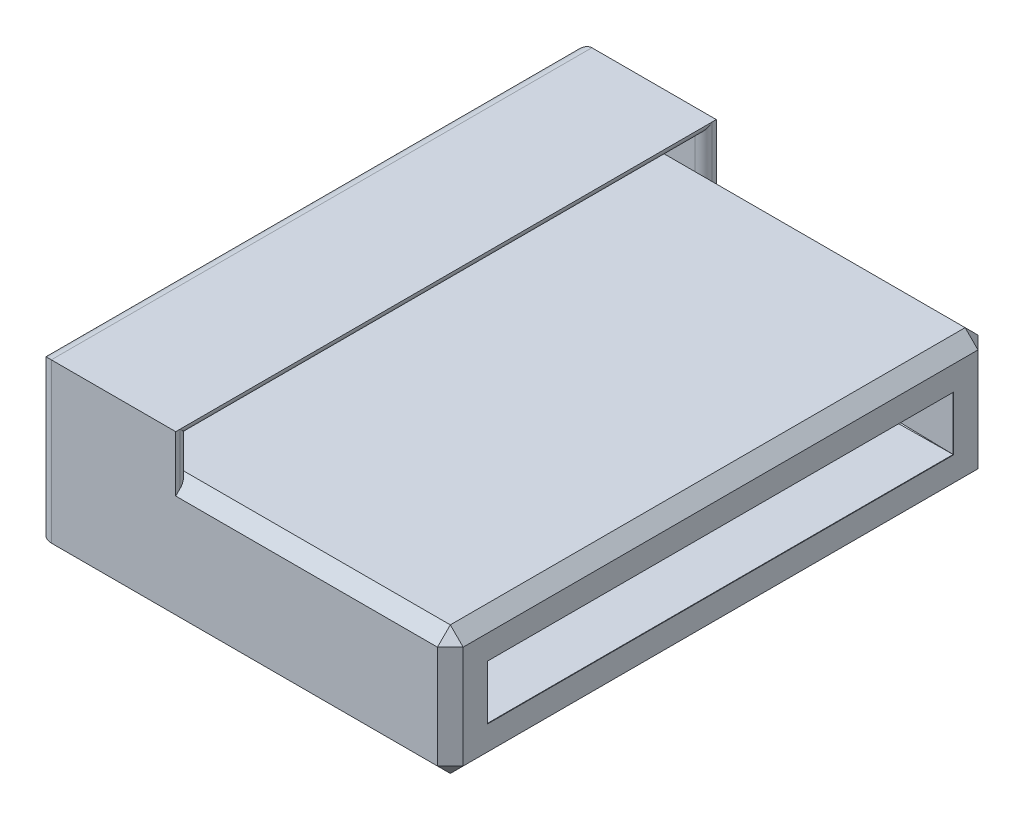
ISO-10303-21;
HEADER;
FILE_DESCRIPTION(('STEP AP214'),'2;1');
FILE_NAME('part.step','',(''),(''),'','','');
FILE_SCHEMA(('AUTOMOTIVE_DESIGN { 1 0 10303 214 1 1 1 1 }'));
ENDSEC;
DATA;
#1=APPLICATION_CONTEXT('core data for automotive mechanical design processes');
#2=APPLICATION_PROTOCOL_DEFINITION('international standard','automotive_design',2000,#1);
#3=PRODUCT_CONTEXT('',#1,'mechanical');
#4=PRODUCT('Part','Part','',(#3));
#5=PRODUCT_RELATED_PRODUCT_CATEGORY('part','',(#4));
#6=PRODUCT_DEFINITION_FORMATION('','',#4);
#7=PRODUCT_DEFINITION_CONTEXT('part definition',#1,'design');
#8=PRODUCT_DEFINITION('design','',#6,#7);
#9=PRODUCT_DEFINITION_SHAPE('','',#8);
#10=(LENGTH_UNIT() NAMED_UNIT(*) SI_UNIT(.MILLI.,.METRE.));
#11=(NAMED_UNIT(*) PLANE_ANGLE_UNIT() SI_UNIT($,.RADIAN.));
#12=(NAMED_UNIT(*) SI_UNIT($,.STERADIAN.) SOLID_ANGLE_UNIT());
#13=UNCERTAINTY_MEASURE_WITH_UNIT(LENGTH_MEASURE(1.E-05),#10,'distance_accuracy_value','');
#14=(GEOMETRIC_REPRESENTATION_CONTEXT(3) GLOBAL_UNCERTAINTY_ASSIGNED_CONTEXT((#13)) GLOBAL_UNIT_ASSIGNED_CONTEXT((#10,
#11,#12)) REPRESENTATION_CONTEXT('',''));
#15=CARTESIAN_POINT('',(0.,0.,0.));
#16=DIRECTION('',(0.,0.,1.));
#17=DIRECTION('',(1.,0.,0.));
#18=AXIS2_PLACEMENT_3D('',#15,#16,#17);
#19=CARTESIAN_POINT('',(24.,20.,31.5));
#20=DIRECTION('',(-1.,0.,0.));
#21=DIRECTION('',(0.,0.,1.));
#22=AXIS2_PLACEMENT_3D('',#19,#20,#21);
#23=PLANE('',#22);
#24=DIRECTION('',(0.,0.,-1.));
#25=VECTOR('',#24,1.);
#26=CARTESIAN_POINT('',(24.,1.50000000000002,-31.5));
#27=LINE('',#26,#25);
#28=CARTESIAN_POINT('',(24.,1.50000000000002,30.));
#29=VERTEX_POINT('',#28);
#30=CARTESIAN_POINT('',(24.,1.50000000000002,-30.));
#31=VERTEX_POINT('',#30);
#32=EDGE_CURVE('E460',#29,#31,#27,.T.);
#33=ORIENTED_EDGE('',*,*,#32,.T.);
#34=DIRECTION('',(0.,1.,0.));
#35=VECTOR('',#34,1.);
#36=CARTESIAN_POINT('',(24.,20.,-30.));
#37=LINE('',#36,#35);
#38=CARTESIAN_POINT('',(24.,13.5,-30.));
#39=VERTEX_POINT('',#38);
#40=EDGE_CURVE('E466',#31,#39,#37,.T.);
#41=ORIENTED_EDGE('',*,*,#40,.T.);
#42=DIRECTION('',(0.,0.,1.));
#43=VECTOR('',#42,1.);
#44=CARTESIAN_POINT('',(24.,13.5,31.5));
#45=LINE('',#44,#43);
#46=CARTESIAN_POINT('',(24.,13.5,30.));
#47=VERTEX_POINT('',#46);
#48=EDGE_CURVE('E464',#39,#47,#45,.T.);
#49=ORIENTED_EDGE('',*,*,#48,.T.);
#50=DIRECTION('',(0.,-1.,0.));
#51=VECTOR('',#50,1.);
#52=CARTESIAN_POINT('',(24.,20.,30.));
#53=LINE('',#52,#51);
#54=EDGE_CURVE('E462',#47,#29,#53,.T.);
#55=ORIENTED_EDGE('',*,*,#54,.T.);
#56=EDGE_LOOP('',(#33,#41,#49,#55));
#57=FACE_BOUND('',#56,.T.);
#58=DIRECTION('',(0.,0.,-1.));
#59=VECTOR('',#58,1.);
#60=CARTESIAN_POINT('',(24.,4.3284271247462,31.5));
#61=LINE('',#60,#59);
#62=CARTESIAN_POINT('',(24.,4.3284271247462,27.1715728752538));
#63=VERTEX_POINT('',#62);
#64=CARTESIAN_POINT('',(24.,4.3284271247462,-27.1715728752538));
#65=VERTEX_POINT('',#64);
#66=EDGE_CURVE('E252',#63,#65,#61,.T.);
#67=ORIENTED_EDGE('',*,*,#66,.F.);
#68=DIRECTION('',(0.,1.,0.));
#69=VECTOR('',#68,1.);
#70=CARTESIAN_POINT('',(24.,20.,27.1715728752538));
#71=LINE('',#70,#69);
#72=CARTESIAN_POINT('',(24.,10.6715728752538,27.1715728752538));
#73=VERTEX_POINT('',#72);
#74=EDGE_CURVE('E254',#73,#63,#71,.F.);
#75=ORIENTED_EDGE('',*,*,#74,.F.);
#76=DIRECTION('',(0.,0.,-1.));
#77=VECTOR('',#76,1.);
#78=CARTESIAN_POINT('',(24.,10.6715728752538,0.));
#79=LINE('',#78,#77);
#80=CARTESIAN_POINT('',(24.,10.6715728752538,-27.1715728752538));
#81=VERTEX_POINT('',#80);
#82=EDGE_CURVE('E267',#81,#73,#79,.F.);
#83=ORIENTED_EDGE('',*,*,#82,.F.);
#84=DIRECTION('',(0.,-1.,0.));
#85=VECTOR('',#84,1.);
#86=CARTESIAN_POINT('',(24.,20.,-27.1715728752538));
#87=LINE('',#86,#85);
#88=EDGE_CURVE('E269',#65,#81,#87,.F.);
#89=ORIENTED_EDGE('',*,*,#88,.F.);
#90=EDGE_LOOP('',(#67,#75,#83,#89));
#91=FACE_BOUND('',#90,.T.);
#92=ADVANCED_FACE('F35',(#57,#91),#23,.F.);
#93=CARTESIAN_POINT('',(-8.,15.,-31.5));
#94=DIRECTION('',(-1.,0.,0.));
#95=DIRECTION('',(0.,0.,1.));
#96=AXIS2_PLACEMENT_3D('',#93,#94,#95);
#97=PLANE('',#96);
#98=DIRECTION('',(0.,0.,1.));
#99=VECTOR('',#98,1.);
#100=CARTESIAN_POINT('',(-8.,20.,-31.5));
#101=LINE('',#100,#99);
#102=CARTESIAN_POINT('',(-8.,20.,-31.5));
#103=VERTEX_POINT('',#102);
#104=CARTESIAN_POINT('',(-8.,20.,-31.));
#105=VERTEX_POINT('',#104);
#106=EDGE_CURVE('E523',#103,#105,#101,.T.);
#107=ORIENTED_EDGE('',*,*,#106,.T.);
#108=DIRECTION('',(0.,1.,0.));
#109=VECTOR('',#108,1.);
#110=CARTESIAN_POINT('',(-8.,15.,-31.));
#111=LINE('',#110,#109);
#112=CARTESIAN_POINT('',(-8.,14.,-31.));
#113=VERTEX_POINT('',#112);
#114=EDGE_CURVE('E548',#105,#113,#111,.F.);
#115=ORIENTED_EDGE('',*,*,#114,.T.);
#116=DIRECTION('',(0.,0.707106781186548,0.707106781186548));
#117=VECTOR('',#116,1.);
#118=CARTESIAN_POINT('',(-8.,14.25,-30.75));
#119=LINE('',#118,#117);
#120=CARTESIAN_POINT('',(-8.,13.5,-31.5));
#121=VERTEX_POINT('',#120);
#122=EDGE_CURVE('E485',#113,#121,#119,.F.);
#123=ORIENTED_EDGE('',*,*,#122,.T.);
#124=DIRECTION('',(0.,1.,0.));
#125=VECTOR('',#124,1.);
#126=CARTESIAN_POINT('',(-8.,15.,-31.5));
#127=LINE('',#126,#125);
#128=EDGE_CURVE('E536',#121,#103,#127,.T.);
#129=ORIENTED_EDGE('',*,*,#128,.T.);
#130=EDGE_LOOP('',(#107,#115,#123,#129));
#131=FACE_BOUND('',#130,.T.);
#132=ADVANCED_FACE('F625',(#131),#97,.F.);
#133=CARTESIAN_POINT('',(-24.,20.,-31.5));
#134=DIRECTION('',(0.,0.,1.));
#135=DIRECTION('',(1.,0.,0.));
#136=AXIS2_PLACEMENT_3D('',#133,#134,#135);
#137=PLANE('',#136);
#138=DIRECTION('',(0.,-1.,0.));
#139=VECTOR('',#138,1.);
#140=CARTESIAN_POINT('',(22.5,20.,-31.5));
#141=LINE('',#140,#139);
#142=CARTESIAN_POINT('',(22.5,13.5,-31.5));
#143=VERTEX_POINT('',#142);
#144=CARTESIAN_POINT('',(22.5,1.50000000000002,-31.5));
#145=VERTEX_POINT('',#144);
#146=EDGE_CURVE('E440',#143,#145,#141,.T.);
#147=ORIENTED_EDGE('',*,*,#146,.T.);
#148=DIRECTION('',(-1.,0.,0.));
#149=VECTOR('',#148,1.);
#150=CARTESIAN_POINT('',(-22.5,1.50000000000002,-31.5));
#151=LINE('',#150,#149);
#152=CARTESIAN_POINT('',(-22.5,1.50000000000002,-31.5));
#153=VERTEX_POINT('',#152);
#154=EDGE_CURVE('E442',#145,#153,#151,.T.);
#155=ORIENTED_EDGE('',*,*,#154,.T.);
#156=DIRECTION('',(0.,-1.,0.));
#157=VECTOR('',#156,1.);
#158=CARTESIAN_POINT('',(-22.5,20.,-31.5));
#159=LINE('',#158,#157);
#160=CARTESIAN_POINT('',(-22.5,20.,-31.5));
#161=VERTEX_POINT('',#160);
#162=EDGE_CURVE('E560',#153,#161,#159,.F.);
#163=ORIENTED_EDGE('',*,*,#162,.T.);
#164=DIRECTION('',(-1.,0.,0.));
#165=VECTOR('',#164,1.);
#166=CARTESIAN_POINT('',(-24.,20.,-31.5));
#167=LINE('',#166,#165);
#168=EDGE_CURVE('E538',#103,#161,#167,.T.);
#169=ORIENTED_EDGE('',*,*,#168,.F.);
#170=ORIENTED_EDGE('',*,*,#128,.F.);
#171=DIRECTION('',(1.,0.,0.));
#172=VECTOR('',#171,1.);
#173=CARTESIAN_POINT('',(-24.,13.5,-31.5));
#174=LINE('',#173,#172);
#175=EDGE_CURVE('E438',#121,#143,#174,.T.);
#176=ORIENTED_EDGE('',*,*,#175,.T.);
#177=EDGE_LOOP('',(#147,#155,#163,#169,#170,#176));
#178=FACE_BOUND('',#177,.T.);
#179=ADVANCED_FACE('F630',(#178),#137,.F.);
#180=CARTESIAN_POINT('',(-24.,20.,31.5));
#181=DIRECTION('',(1.,0.,0.));
#182=DIRECTION('',(0.,0.,-1.));
#183=AXIS2_PLACEMENT_3D('',#180,#181,#182);
#184=PLANE('',#183);
#185=DIRECTION('',(0.,-1.,0.));
#186=VECTOR('',#185,1.);
#187=CARTESIAN_POINT('',(-24.,20.,-30.));
#188=LINE('',#187,#186);
#189=CARTESIAN_POINT('',(-24.,18.5,-30.));
#190=VERTEX_POINT('',#189);
#191=CARTESIAN_POINT('',(-24.,1.50000000000002,-30.));
#192=VERTEX_POINT('',#191);
#193=EDGE_CURVE('E557',#190,#192,#188,.T.);
#194=ORIENTED_EDGE('',*,*,#193,.T.);
#195=DIRECTION('',(0.,0.,1.));
#196=VECTOR('',#195,1.);
#197=CARTESIAN_POINT('',(-24.,1.50000000000002,30.));
#198=LINE('',#197,#196);
#199=CARTESIAN_POINT('',(-24.,1.50000000000002,30.));
#200=VERTEX_POINT('',#199);
#201=EDGE_CURVE('E456',#192,#200,#198,.T.);
#202=ORIENTED_EDGE('',*,*,#201,.T.);
#203=DIRECTION('',(0.,-1.,0.));
#204=VECTOR('',#203,1.);
#205=CARTESIAN_POINT('',(-24.,20.,30.));
#206=LINE('',#205,#204);
#207=CARTESIAN_POINT('',(-24.,18.5,30.));
#208=VERTEX_POINT('',#207);
#209=EDGE_CURVE('E511',#200,#208,#206,.F.);
#210=ORIENTED_EDGE('',*,*,#209,.T.);
#211=DIRECTION('',(0.,0.,1.));
#212=VECTOR('',#211,1.);
#213=CARTESIAN_POINT('',(-24.,18.5,31.5));
#214=LINE('',#213,#212);
#215=EDGE_CURVE('E555',#208,#190,#214,.F.);
#216=ORIENTED_EDGE('',*,*,#215,.T.);
#217=EDGE_LOOP('',(#194,#202,#210,#216));
#218=FACE_BOUND('',#217,.T.);
#219=ADVANCED_FACE('F771',(#218),#184,.F.);
#220=CARTESIAN_POINT('',(-24.,20.,31.5));
#221=DIRECTION('',(0.,0.,-1.));
#222=DIRECTION('',(-1.,0.,0.));
#223=AXIS2_PLACEMENT_3D('',#220,#221,#222);
#224=PLANE('',#223);
#225=DIRECTION('',(-1.,0.,0.));
#226=VECTOR('',#225,1.);
#227=CARTESIAN_POINT('',(-24.,13.5,31.5));
#228=LINE('',#227,#226);
#229=CARTESIAN_POINT('',(22.5,13.5,31.5));
#230=VERTEX_POINT('',#229);
#231=CARTESIAN_POINT('',(-7.99999999999999,13.5,31.5));
#232=VERTEX_POINT('',#231);
#233=EDGE_CURVE('E479',#230,#232,#228,.T.);
#234=ORIENTED_EDGE('',*,*,#233,.T.);
#235=DIRECTION('',(0.,1.,0.));
#236=VECTOR('',#235,1.);
#237=CARTESIAN_POINT('',(-7.99999999999999,15.,31.5));
#238=LINE('',#237,#236);
#239=CARTESIAN_POINT('',(-7.99999999999999,20.,31.5));
#240=VERTEX_POINT('',#239);
#241=EDGE_CURVE('E494',#232,#240,#238,.T.);
#242=ORIENTED_EDGE('',*,*,#241,.T.);
#243=DIRECTION('',(1.,0.,0.));
#244=VECTOR('',#243,1.);
#245=CARTESIAN_POINT('',(-24.,20.,31.5));
#246=LINE('',#245,#244);
#247=CARTESIAN_POINT('',(-22.5,20.,31.5));
#248=VERTEX_POINT('',#247);
#249=EDGE_CURVE('E542',#248,#240,#246,.T.);
#250=ORIENTED_EDGE('',*,*,#249,.F.);
#251=DIRECTION('',(0.,-1.,0.));
#252=VECTOR('',#251,1.);
#253=CARTESIAN_POINT('',(-22.5,20.,31.5));
#254=LINE('',#253,#252);
#255=CARTESIAN_POINT('',(-22.5,1.50000000000002,31.5));
#256=VERTEX_POINT('',#255);
#257=EDGE_CURVE('E435',#248,#256,#254,.T.);
#258=ORIENTED_EDGE('',*,*,#257,.T.);
#259=DIRECTION('',(1.,0.,0.));
#260=VECTOR('',#259,1.);
#261=CARTESIAN_POINT('',(24.,1.50000000000002,31.5));
#262=LINE('',#261,#260);
#263=CARTESIAN_POINT('',(22.5,1.50000000000002,31.5));
#264=VERTEX_POINT('',#263);
#265=EDGE_CURVE('E475',#256,#264,#262,.T.);
#266=ORIENTED_EDGE('',*,*,#265,.T.);
#267=DIRECTION('',(0.,1.,0.));
#268=VECTOR('',#267,1.);
#269=CARTESIAN_POINT('',(22.5,20.,31.5));
#270=LINE('',#269,#268);
#271=EDGE_CURVE('E477',#264,#230,#270,.T.);
#272=ORIENTED_EDGE('',*,*,#271,.T.);
#273=EDGE_LOOP('',(#234,#242,#250,#258,#266,#272));
#274=FACE_BOUND('',#273,.T.);
#275=ADVANCED_FACE('F569',(#274),#224,.F.);
#276=CARTESIAN_POINT('',(0.,20.,0.));
#277=DIRECTION('',(0.,-1.,0.));
#278=DIRECTION('',(0.,0.,-1.));
#279=AXIS2_PLACEMENT_3D('',#276,#277,#278);
#280=PLANE('',#279);
#281=ORIENTED_EDGE('',*,*,#168,.T.);
#282=DIRECTION('',(0.,0.,1.));
#283=VECTOR('',#282,1.);
#284=CARTESIAN_POINT('',(-22.5,20.,0.));
#285=LINE('',#284,#283);
#286=EDGE_CURVE('E561',#161,#248,#285,.T.);
#287=ORIENTED_EDGE('',*,*,#286,.T.);
#288=ORIENTED_EDGE('',*,*,#249,.T.);
#289=CARTESIAN_POINT('',(-7.99999999999999,20.,31.));
#290=VERTEX_POINT('',#289);
#291=EDGE_CURVE('E519',#290,#240,#101,.T.);
#292=ORIENTED_EDGE('',*,*,#291,.F.);
#293=EDGE_CURVE('E521',#105,#290,#101,.T.);
#294=ORIENTED_EDGE('',*,*,#293,.F.);
#295=ORIENTED_EDGE('',*,*,#106,.F.);
#296=EDGE_LOOP('',(#281,#287,#288,#292,#294,#295));
#297=FACE_BOUND('',#296,.T.);
#298=ADVANCED_FACE('F765',(#297),#280,.F.);
#299=CARTESIAN_POINT('',(0.,0.,0.));
#300=DIRECTION('',(0.,-1.,0.));
#301=DIRECTION('',(0.,0.,-1.));
#302=AXIS2_PLACEMENT_3D('',#299,#300,#301);
#303=PLANE('',#302);
#304=DIRECTION('',(0.,0.,-1.));
#305=VECTOR('',#304,1.);
#306=CARTESIAN_POINT('',(-22.5,0.,-30.));
#307=LINE('',#306,#305);
#308=CARTESIAN_POINT('',(-22.5,0.,30.));
#309=VERTEX_POINT('',#308);
#310=CARTESIAN_POINT('',(-22.5,0.,-30.));
#311=VERTEX_POINT('',#310);
#312=EDGE_CURVE('E449',#309,#311,#307,.T.);
#313=ORIENTED_EDGE('',*,*,#312,.T.);
#314=DIRECTION('',(1.,0.,0.));
#315=VECTOR('',#314,1.);
#316=CARTESIAN_POINT('',(24.,0.,-30.));
#317=LINE('',#316,#315);
#318=CARTESIAN_POINT('',(22.5,0.,-30.));
#319=VERTEX_POINT('',#318);
#320=EDGE_CURVE('E451',#311,#319,#317,.T.);
#321=ORIENTED_EDGE('',*,*,#320,.T.);
#322=DIRECTION('',(0.,0.,1.));
#323=VECTOR('',#322,1.);
#324=CARTESIAN_POINT('',(22.5,0.,31.5));
#325=LINE('',#324,#323);
#326=CARTESIAN_POINT('',(22.5,0.,30.));
#327=VERTEX_POINT('',#326);
#328=EDGE_CURVE('E445',#319,#327,#325,.T.);
#329=ORIENTED_EDGE('',*,*,#328,.T.);
#330=DIRECTION('',(-1.,0.,0.));
#331=VECTOR('',#330,1.);
#332=CARTESIAN_POINT('',(-22.5,0.,30.));
#333=LINE('',#332,#331);
#334=EDGE_CURVE('E447',#327,#309,#333,.T.);
#335=ORIENTED_EDGE('',*,*,#334,.T.);
#336=EDGE_LOOP('',(#313,#321,#329,#335));
#337=FACE_BOUND('',#336,.T.);
#338=ADVANCED_FACE('F587',(#337),#303,.T.);
#339=ORIENTED_EDGE('',*,*,#241,.F.);
#340=DIRECTION('',(0.,-0.707106781186548,0.707106781186548));
#341=VECTOR('',#340,1.);
#342=CARTESIAN_POINT('',(-8.,45.75,-0.750000000000001));
#343=LINE('',#342,#341);
#344=CARTESIAN_POINT('',(-7.99999999999999,14.,31.));
#345=VERTEX_POINT('',#344);
#346=EDGE_CURVE('E45',#232,#345,#343,.F.);
#347=ORIENTED_EDGE('',*,*,#346,.T.);
#348=DIRECTION('',(0.,-1.,0.));
#349=VECTOR('',#348,1.);
#350=CARTESIAN_POINT('',(-7.99999999999999,15.,31.));
#351=LINE('',#350,#349);
#352=EDGE_CURVE('E60',#345,#290,#351,.F.);
#353=ORIENTED_EDGE('',*,*,#352,.T.);
#354=ORIENTED_EDGE('',*,*,#291,.T.);
#355=EDGE_LOOP('',(#339,#347,#353,#354));
#356=FACE_BOUND('',#355,.T.);
#357=ADVANCED_FACE('F490',(#356),#97,.F.);
#358=CARTESIAN_POINT('',(0.,15.,0.));
#359=DIRECTION('',(0.,-1.,0.));
#360=DIRECTION('',(0.,0.,-1.));
#361=AXIS2_PLACEMENT_3D('',#358,#359,#360);
#362=PLANE('',#361);
#363=DIRECTION('',(0.,0.,-1.));
#364=VECTOR('',#363,1.);
#365=CARTESIAN_POINT('',(22.5,15.,0.));
#366=LINE('',#365,#364);
#367=CARTESIAN_POINT('',(22.5,15.,30.));
#368=VERTEX_POINT('',#367);
#369=CARTESIAN_POINT('',(22.5,15.,-30.));
#370=VERTEX_POINT('',#369);
#371=EDGE_CURVE('E471',#368,#370,#366,.T.);
#372=ORIENTED_EDGE('',*,*,#371,.T.);
#373=DIRECTION('',(-1.,0.,0.));
#374=VECTOR('',#373,1.);
#375=CARTESIAN_POINT('',(0.,15.,-30.));
#376=LINE('',#375,#374);
#377=CARTESIAN_POINT('',(-9.,15.,-30.));
#378=VERTEX_POINT('',#377);
#379=EDGE_CURVE('E473',#370,#378,#376,.T.);
#380=ORIENTED_EDGE('',*,*,#379,.T.);
#381=DIRECTION('',(1.,0.,0.));
#382=VECTOR('',#381,1.);
#383=CARTESIAN_POINT('',(-22.,15.,-30.));
#384=LINE('',#383,#382);
#385=CARTESIAN_POINT('',(-22.,15.,-30.));
#386=VERTEX_POINT('',#385);
#387=EDGE_CURVE('E532',#386,#378,#384,.T.);
#388=ORIENTED_EDGE('',*,*,#387,.F.);
#389=DIRECTION('',(0.,0.,-1.));
#390=VECTOR('',#389,1.);
#391=CARTESIAN_POINT('',(-22.,15.,-30.));
#392=LINE('',#391,#390);
#393=CARTESIAN_POINT('',(-22.,15.,30.));
#394=VERTEX_POINT('',#393);
#395=EDGE_CURVE('E517',#394,#386,#392,.T.);
#396=ORIENTED_EDGE('',*,*,#395,.F.);
#397=DIRECTION('',(1.,0.,0.));
#398=VECTOR('',#397,1.);
#399=CARTESIAN_POINT('',(-22.,15.,30.));
#400=LINE('',#399,#398);
#401=CARTESIAN_POINT('',(-8.99999999999999,15.,30.));
#402=VERTEX_POINT('',#401);
#403=EDGE_CURVE('E508',#394,#402,#400,.T.);
#404=ORIENTED_EDGE('',*,*,#403,.T.);
#405=DIRECTION('',(1.,0.,0.));
#406=VECTOR('',#405,1.);
#407=CARTESIAN_POINT('',(0.,15.,30.));
#408=LINE('',#407,#406);
#409=EDGE_CURVE('E469',#402,#368,#408,.T.);
#410=ORIENTED_EDGE('',*,*,#409,.T.);
#411=EDGE_LOOP('',(#372,#380,#388,#396,#404,#410));
#412=FACE_BOUND('',#411,.T.);
#413=ADVANCED_FACE('F515',(#412),#362,.F.);
#414=CARTESIAN_POINT('',(-22.,15.,30.));
#415=DIRECTION('',(0.,0.,1.));
#416=DIRECTION('',(1.,0.,0.));
#417=AXIS2_PLACEMENT_3D('',#414,#415,#416);
#418=PLANE('',#417);
#419=DIRECTION('',(1.,0.,0.));
#420=VECTOR('',#419,1.);
#421=CARTESIAN_POINT('',(-22.,19.,30.));
#422=LINE('',#421,#420);
#423=CARTESIAN_POINT('',(-22.,19.,30.));
#424=VERTEX_POINT('',#423);
#425=CARTESIAN_POINT('',(-8.99999999999999,19.,30.));
#426=VERTEX_POINT('',#425);
#427=EDGE_CURVE('E510',#424,#426,#422,.T.);
#428=ORIENTED_EDGE('',*,*,#427,.T.);
#429=DIRECTION('',(0.,-1.,0.));
#430=VECTOR('',#429,1.);
#431=CARTESIAN_POINT('',(-8.99999999999999,15.,30.));
#432=LINE('',#431,#430);
#433=EDGE_CURVE('E501',#426,#402,#432,.T.);
#434=ORIENTED_EDGE('',*,*,#433,.T.);
#435=ORIENTED_EDGE('',*,*,#403,.F.);
#436=DIRECTION('',(0.,-1.,0.));
#437=VECTOR('',#436,1.);
#438=CARTESIAN_POINT('',(-22.,15.,30.));
#439=LINE('',#438,#437);
#440=EDGE_CURVE('E527',#424,#394,#439,.T.);
#441=ORIENTED_EDGE('',*,*,#440,.F.);
#442=EDGE_LOOP('',(#428,#434,#435,#441));
#443=FACE_BOUND('',#442,.T.);
#444=ADVANCED_FACE('F506',(#443),#418,.F.);
#445=CARTESIAN_POINT('',(-22.,19.,30.));
#446=DIRECTION('',(0.,1.,0.));
#447=DIRECTION('',(0.,0.,1.));
#448=AXIS2_PLACEMENT_3D('',#445,#446,#447);
#449=PLANE('',#448);
#450=DIRECTION('',(1.,0.,0.));
#451=VECTOR('',#450,1.);
#452=CARTESIAN_POINT('',(-22.,19.,-30.));
#453=LINE('',#452,#451);
#454=CARTESIAN_POINT('',(-22.,19.,-30.));
#455=VERTEX_POINT('',#454);
#456=CARTESIAN_POINT('',(-9.,19.,-30.));
#457=VERTEX_POINT('',#456);
#458=EDGE_CURVE('E524',#455,#457,#453,.T.);
#459=ORIENTED_EDGE('',*,*,#458,.T.);
#460=DIRECTION('',(0.,0.,1.));
#461=VECTOR('',#460,1.);
#462=CARTESIAN_POINT('',(-8.99999999999999,19.,30.));
#463=LINE('',#462,#461);
#464=EDGE_CURVE('E512',#457,#426,#463,.T.);
#465=ORIENTED_EDGE('',*,*,#464,.T.);
#466=ORIENTED_EDGE('',*,*,#427,.F.);
#467=DIRECTION('',(0.,0.,1.));
#468=VECTOR('',#467,1.);
#469=CARTESIAN_POINT('',(-22.,19.,30.));
#470=LINE('',#469,#468);
#471=EDGE_CURVE('E744',#455,#424,#470,.T.);
#472=ORIENTED_EDGE('',*,*,#471,.F.);
#473=EDGE_LOOP('',(#459,#465,#466,#472));
#474=FACE_BOUND('',#473,.T.);
#475=ADVANCED_FACE('F742',(#474),#449,.F.);
#476=CARTESIAN_POINT('',(-22.,19.,-30.));
#477=DIRECTION('',(0.,0.,-1.));
#478=DIRECTION('',(-1.,0.,0.));
#479=AXIS2_PLACEMENT_3D('',#476,#477,#478);
#480=PLANE('',#479);
#481=ORIENTED_EDGE('',*,*,#387,.T.);
#482=DIRECTION('',(0.,1.,0.));
#483=VECTOR('',#482,1.);
#484=CARTESIAN_POINT('',(-9.,19.,-30.));
#485=LINE('',#484,#483);
#486=EDGE_CURVE('E544',#378,#457,#485,.T.);
#487=ORIENTED_EDGE('',*,*,#486,.T.);
#488=ORIENTED_EDGE('',*,*,#458,.F.);
#489=DIRECTION('',(0.,1.,0.));
#490=VECTOR('',#489,1.);
#491=CARTESIAN_POINT('',(-22.,19.,-30.));
#492=LINE('',#491,#490);
#493=EDGE_CURVE('E747',#386,#455,#492,.T.);
#494=ORIENTED_EDGE('',*,*,#493,.F.);
#495=EDGE_LOOP('',(#481,#487,#488,#494));
#496=FACE_BOUND('',#495,.T.);
#497=ADVANCED_FACE('F738',(#496),#480,.F.);
#498=CARTESIAN_POINT('',(-22.,0.,0.));
#499=DIRECTION('',(-1.,0.,0.));
#500=DIRECTION('',(0.,0.,1.));
#501=AXIS2_PLACEMENT_3D('',#498,#499,#500);
#502=PLANE('',#501);
#503=ORIENTED_EDGE('',*,*,#395,.T.);
#504=ORIENTED_EDGE('',*,*,#493,.T.);
#505=ORIENTED_EDGE('',*,*,#471,.T.);
#506=ORIENTED_EDGE('',*,*,#440,.T.);
#507=EDGE_LOOP('',(#503,#504,#505,#506));
#508=FACE_BOUND('',#507,.T.);
#509=ADVANCED_FACE('F647',(#508),#502,.F.);
#510=CARTESIAN_POINT('',(-8.99999999999999,15.,31.));
#511=DIRECTION('',(0.,-1.,0.));
#512=DIRECTION('',(0.,0.,-1.));
#513=AXIS2_PLACEMENT_3D('',#510,#511,#512);
#514=CYLINDRICAL_SURFACE('',#513,1.);
#515=ORIENTED_EDGE('',*,*,#352,.F.);
#516=CARTESIAN_POINT('',(-8.99999999999999,14.,31.));
#517=DIRECTION('',(0.,-0.707106781186547,-0.707106781186547));
#518=DIRECTION('',(0.,-0.707106781186548,0.707106781186548));
#519=AXIS2_PLACEMENT_3D('',#516,#517,#518);
#520=ELLIPSE('',#519,1.4142135623731,1.);
#521=EDGE_CURVE('E11',#345,#402,#520,.F.);
#522=ORIENTED_EDGE('',*,*,#521,.T.);
#523=ORIENTED_EDGE('',*,*,#433,.F.);
#524=CARTESIAN_POINT('',(-8.99999999999999,20.,31.));
#525=DIRECTION('',(0.,-0.707106781186547,0.707106781186547));
#526=DIRECTION('',(0.,0.707106781186547,0.707106781186547));
#527=AXIS2_PLACEMENT_3D('',#524,#525,#526);
#528=ELLIPSE('',#527,1.41421356237309,1.);
#529=EDGE_CURVE('E552',#290,#426,#528,.F.);
#530=ORIENTED_EDGE('',*,*,#529,.F.);
#531=EDGE_LOOP('',(#515,#522,#523,#530));
#532=FACE_BOUND('',#531,.T.);
#533=ADVANCED_FACE('F500',(#532),#514,.T.);
#534=CARTESIAN_POINT('',(-8.99999999999999,20.,30.));
#535=DIRECTION('',(0.,0.,1.));
#536=DIRECTION('',(1.,0.,0.));
#537=AXIS2_PLACEMENT_3D('',#534,#535,#536);
#538=CYLINDRICAL_SURFACE('',#537,1.);
#539=ORIENTED_EDGE('',*,*,#529,.T.);
#540=ORIENTED_EDGE('',*,*,#464,.F.);
#541=CARTESIAN_POINT('',(-9.,20.,-31.));
#542=DIRECTION('',(0.,0.707106781186547,0.707106781186547));
#543=DIRECTION('',(0.,0.707106781186547,-0.707106781186547));
#544=AXIS2_PLACEMENT_3D('',#541,#542,#543);
#545=ELLIPSE('',#544,1.41421356237309,1.);
#546=EDGE_CURVE('E432',#105,#457,#545,.F.);
#547=ORIENTED_EDGE('',*,*,#546,.F.);
#548=ORIENTED_EDGE('',*,*,#293,.T.);
#549=EDGE_LOOP('',(#539,#540,#547,#548));
#550=FACE_BOUND('',#549,.T.);
#551=ADVANCED_FACE('F640',(#550),#538,.T.);
#552=CARTESIAN_POINT('',(-9.,19.,-31.));
#553=DIRECTION('',(0.,1.,0.));
#554=DIRECTION('',(0.,0.,1.));
#555=AXIS2_PLACEMENT_3D('',#552,#553,#554);
#556=CYLINDRICAL_SURFACE('',#555,1.);
#557=ORIENTED_EDGE('',*,*,#486,.F.);
#558=CARTESIAN_POINT('',(-9.,14.,-31.));
#559=DIRECTION('',(0.,-0.707106781186547,0.707106781186547));
#560=DIRECTION('',(0.,0.707106781186548,0.707106781186548));
#561=AXIS2_PLACEMENT_3D('',#558,#559,#560);
#562=ELLIPSE('',#561,1.4142135623731,1.);
#563=EDGE_CURVE('E482',#378,#113,#562,.F.);
#564=ORIENTED_EDGE('',*,*,#563,.T.);
#565=ORIENTED_EDGE('',*,*,#114,.F.);
#566=ORIENTED_EDGE('',*,*,#546,.T.);
#567=EDGE_LOOP('',(#557,#564,#565,#566));
#568=FACE_BOUND('',#567,.T.);
#569=ADVANCED_FACE('F636',(#568),#556,.T.);
#570=CARTESIAN_POINT('',(-22.5,20.,30.));
#571=DIRECTION('',(0.,-1.,0.));
#572=DIRECTION('',(0.,0.,-1.));
#573=AXIS2_PLACEMENT_3D('',#570,#571,#572);
#574=CYLINDRICAL_SURFACE('',#573,1.5);
#575=ORIENTED_EDGE('',*,*,#209,.F.);
#576=CARTESIAN_POINT('',(-22.5,1.50000000000002,30.));
#577=DIRECTION('',(0.,-1.,0.));
#578=DIRECTION('',(0.,0.,-1.));
#579=AXIS2_PLACEMENT_3D('',#576,#577,#578);
#580=CIRCLE('',#579,1.5);
#581=EDGE_CURVE('E458',#200,#256,#580,.F.);
#582=ORIENTED_EDGE('',*,*,#581,.T.);
#583=ORIENTED_EDGE('',*,*,#257,.F.);
#584=CARTESIAN_POINT('',(-22.5,18.5,30.));
#585=DIRECTION('',(0.,-0.707106781186547,0.707106781186547));
#586=DIRECTION('',(0.,-0.707106781186547,-0.707106781186547));
#587=AXIS2_PLACEMENT_3D('',#584,#585,#586);
#588=ELLIPSE('',#587,2.12132034355964,1.5);
#589=EDGE_CURVE('E425',#208,#248,#588,.F.);
#590=ORIENTED_EDGE('',*,*,#589,.F.);
#591=EDGE_LOOP('',(#575,#582,#583,#590));
#592=FACE_BOUND('',#591,.T.);
#593=ADVANCED_FACE('F639',(#592),#574,.T.);
#594=CARTESIAN_POINT('',(-22.5,18.5,0.));
#595=DIRECTION('',(0.,0.,1.));
#596=DIRECTION('',(1.,0.,0.));
#597=AXIS2_PLACEMENT_3D('',#594,#595,#596);
#598=CYLINDRICAL_SURFACE('',#597,1.5);
#599=ORIENTED_EDGE('',*,*,#589,.T.);
#600=ORIENTED_EDGE('',*,*,#286,.F.);
#601=CARTESIAN_POINT('',(-22.5,18.5,-30.));
#602=DIRECTION('',(0.,0.707106781186547,0.707106781186547));
#603=DIRECTION('',(0.,-0.707106781186547,0.707106781186547));
#604=AXIS2_PLACEMENT_3D('',#601,#602,#603);
#605=ELLIPSE('',#604,2.12132034355964,1.5);
#606=EDGE_CURVE('E420',#190,#161,#605,.F.);
#607=ORIENTED_EDGE('',*,*,#606,.F.);
#608=ORIENTED_EDGE('',*,*,#215,.F.);
#609=EDGE_LOOP('',(#599,#600,#607,#608));
#610=FACE_BOUND('',#609,.T.);
#611=ADVANCED_FACE('F651',(#610),#598,.T.);
#612=CARTESIAN_POINT('',(-22.5,20.,-30.));
#613=DIRECTION('',(0.,-1.,0.));
#614=DIRECTION('',(0.,0.,-1.));
#615=AXIS2_PLACEMENT_3D('',#612,#613,#614);
#616=CYLINDRICAL_SURFACE('',#615,1.5);
#617=ORIENTED_EDGE('',*,*,#162,.F.);
#618=CARTESIAN_POINT('',(-22.5,1.50000000000002,-30.));
#619=DIRECTION('',(0.,-1.,0.));
#620=DIRECTION('',(0.,0.,-1.));
#621=AXIS2_PLACEMENT_3D('',#618,#619,#620);
#622=CIRCLE('',#621,1.5);
#623=EDGE_CURVE('E454',#153,#192,#622,.F.);
#624=ORIENTED_EDGE('',*,*,#623,.T.);
#625=ORIENTED_EDGE('',*,*,#193,.F.);
#626=ORIENTED_EDGE('',*,*,#606,.T.);
#627=EDGE_LOOP('',(#617,#624,#625,#626));
#628=FACE_BOUND('',#627,.T.);
#629=ADVANCED_FACE('F648',(#628),#616,.T.);
#630=CARTESIAN_POINT('',(0.,15.,30.));
#631=DIRECTION('',(0.,-0.707106781186547,-0.707106781186547));
#632=DIRECTION('',(1.,0.,0.));
#633=AXIS2_PLACEMENT_3D('',#630,#631,#632);
#634=PLANE('',#633);
#635=DIRECTION('',(0.,0.707106781186547,-0.707106781186547));
#636=VECTOR('',#635,1.);
#637=CARTESIAN_POINT('',(22.5,14.25,30.75));
#638=LINE('',#637,#636);
#639=EDGE_CURVE('E40',#368,#230,#638,.F.);
#640=ORIENTED_EDGE('',*,*,#639,.F.);
#641=ORIENTED_EDGE('',*,*,#409,.F.);
#642=ORIENTED_EDGE('',*,*,#521,.F.);
#643=ORIENTED_EDGE('',*,*,#346,.F.);
#644=ORIENTED_EDGE('',*,*,#233,.F.);
#645=EDGE_LOOP('',(#640,#641,#642,#643,#644));
#646=FACE_BOUND('',#645,.T.);
#647=ADVANCED_FACE('F38',(#646),#634,.F.);
#648=CARTESIAN_POINT('',(24.,13.5,30.));
#649=DIRECTION('',(0.577350269189626,0.577350269189626,0.577350269189626));
#650=DIRECTION('',(0.707106781186547,0.,-0.707106781186547));
#651=AXIS2_PLACEMENT_3D('',#648,#649,#650);
#652=PLANE('',#651);
#653=DIRECTION('',(0.707106781186547,-0.707106781186547,0.));
#654=VECTOR('',#653,1.);
#655=CARTESIAN_POINT('',(24.,13.5,30.));
#656=LINE('',#655,#654);
#657=EDGE_CURVE('E411',#368,#47,#656,.T.);
#658=ORIENTED_EDGE('',*,*,#657,.F.);
#659=ORIENTED_EDGE('',*,*,#639,.T.);
#660=DIRECTION('',(-0.707106781186547,0.,0.707106781186547));
#661=VECTOR('',#660,1.);
#662=CARTESIAN_POINT('',(24.,13.5,30.));
#663=LINE('',#662,#661);
#664=EDGE_CURVE('E413',#47,#230,#663,.T.);
#665=ORIENTED_EDGE('',*,*,#664,.F.);
#666=EDGE_LOOP('',(#658,#659,#665));
#667=FACE_BOUND('',#666,.T.);
#668=ADVANCED_FACE('F613',(#667),#652,.T.);
#669=CARTESIAN_POINT('',(24.,20.,30.));
#670=DIRECTION('',(-0.707106781186547,0.,-0.707106781186547));
#671=DIRECTION('',(0.,-1.,0.));
#672=AXIS2_PLACEMENT_3D('',#669,#670,#671);
#673=PLANE('',#672);
#674=ORIENTED_EDGE('',*,*,#664,.T.);
#675=ORIENTED_EDGE('',*,*,#271,.F.);
#676=DIRECTION('',(0.707106781186547,0.,-0.707106781186547));
#677=VECTOR('',#676,1.);
#678=CARTESIAN_POINT('',(24.,1.50000000000002,30.));
#679=LINE('',#678,#677);
#680=EDGE_CURVE('E405',#29,#264,#679,.F.);
#681=ORIENTED_EDGE('',*,*,#680,.F.);
#682=ORIENTED_EDGE('',*,*,#54,.F.);
#683=EDGE_LOOP('',(#674,#675,#681,#682));
#684=FACE_BOUND('',#683,.T.);
#685=ADVANCED_FACE('F614',(#684),#673,.F.);
#686=CARTESIAN_POINT('',(22.5,15.,0.));
#687=DIRECTION('',(-0.707106781186547,-0.707106781186547,0.));
#688=DIRECTION('',(0.,0.,-1.));
#689=AXIS2_PLACEMENT_3D('',#686,#687,#688);
#690=PLANE('',#689);
#691=ORIENTED_EDGE('',*,*,#657,.T.);
#692=ORIENTED_EDGE('',*,*,#48,.F.);
#693=DIRECTION('',(-0.707106781186547,0.707106781186547,0.));
#694=VECTOR('',#693,1.);
#695=CARTESIAN_POINT('',(24.,13.5,-30.));
#696=LINE('',#695,#694);
#697=EDGE_CURVE('E402',#370,#39,#696,.F.);
#698=ORIENTED_EDGE('',*,*,#697,.F.);
#699=ORIENTED_EDGE('',*,*,#371,.F.);
#700=EDGE_LOOP('',(#691,#692,#698,#699));
#701=FACE_BOUND('',#700,.T.);
#702=ADVANCED_FACE('F612',(#701),#690,.F.);
#703=CARTESIAN_POINT('',(0.,15.,-30.));
#704=DIRECTION('',(0.,-0.707106781186547,0.707106781186547));
#705=DIRECTION('',(-1.,0.,0.));
#706=AXIS2_PLACEMENT_3D('',#703,#704,#705);
#707=PLANE('',#706);
#708=ORIENTED_EDGE('',*,*,#563,.F.);
#709=ORIENTED_EDGE('',*,*,#379,.F.);
#710=DIRECTION('',(0.,-0.707106781186547,-0.707106781186547));
#711=VECTOR('',#710,1.);
#712=CARTESIAN_POINT('',(22.5,14.25,-30.75));
#713=LINE('',#712,#711);
#714=EDGE_CURVE('E399',#143,#370,#713,.F.);
#715=ORIENTED_EDGE('',*,*,#714,.F.);
#716=ORIENTED_EDGE('',*,*,#175,.F.);
#717=ORIENTED_EDGE('',*,*,#122,.F.);
#718=EDGE_LOOP('',(#708,#709,#715,#716,#717));
#719=FACE_BOUND('',#718,.T.);
#720=ADVANCED_FACE('F621',(#719),#707,.F.);
#721=CARTESIAN_POINT('',(-24.,1.50000000000002,31.5));
#722=DIRECTION('',(0.,-0.707106781186547,0.707106781186547));
#723=DIRECTION('',(-1.,0.,0.));
#724=AXIS2_PLACEMENT_3D('',#721,#722,#723);
#725=PLANE('',#724);
#726=DIRECTION('',(0.,-0.707106781186547,-0.707106781186547));
#727=VECTOR('',#726,1.);
#728=CARTESIAN_POINT('',(22.5,0.750000000000008,30.75));
#729=LINE('',#728,#727);
#730=EDGE_CURVE('E408',#264,#327,#729,.T.);
#731=ORIENTED_EDGE('',*,*,#730,.F.);
#732=ORIENTED_EDGE('',*,*,#265,.F.);
#733=DIRECTION('',(0.,0.707106781186547,0.707106781186547));
#734=VECTOR('',#733,1.);
#735=CARTESIAN_POINT('',(-22.5,0.,30.));
#736=LINE('',#735,#734);
#737=EDGE_CURVE('E396',#309,#256,#736,.T.);
#738=ORIENTED_EDGE('',*,*,#737,.F.);
#739=ORIENTED_EDGE('',*,*,#334,.F.);
#740=EDGE_LOOP('',(#731,#732,#738,#739));
#741=FACE_BOUND('',#740,.T.);
#742=ADVANCED_FACE('F575',(#741),#725,.T.);
#743=CARTESIAN_POINT('',(24.,1.50000000000002,30.));
#744=DIRECTION('',(0.577350269189626,-0.577350269189626,0.577350269189626));
#745=DIRECTION('',(0.707106781186547,0.,-0.707106781186547));
#746=AXIS2_PLACEMENT_3D('',#743,#744,#745);
#747=PLANE('',#746);
#748=ORIENTED_EDGE('',*,*,#680,.T.);
#749=ORIENTED_EDGE('',*,*,#730,.T.);
#750=DIRECTION('',(0.707106781186547,0.707106781186547,0.));
#751=VECTOR('',#750,1.);
#752=CARTESIAN_POINT('',(24.,1.50000000000002,30.));
#753=LINE('',#752,#751);
#754=EDGE_CURVE('E393',#29,#327,#753,.F.);
#755=ORIENTED_EDGE('',*,*,#754,.F.);
#756=EDGE_LOOP('',(#748,#749,#755));
#757=FACE_BOUND('',#756,.T.);
#758=ADVANCED_FACE('F591',(#757),#747,.T.);
#759=CARTESIAN_POINT('',(24.,13.5,-30.));
#760=DIRECTION('',(0.577350269189626,0.577350269189626,-0.577350269189626));
#761=DIRECTION('',(-0.707106781186547,0.,-0.707106781186547));
#762=AXIS2_PLACEMENT_3D('',#759,#760,#761);
#763=PLANE('',#762);
#764=ORIENTED_EDGE('',*,*,#714,.T.);
#765=ORIENTED_EDGE('',*,*,#697,.T.);
#766=DIRECTION('',(0.707106781186547,0.,0.707106781186547));
#767=VECTOR('',#766,1.);
#768=CARTESIAN_POINT('',(24.,13.5,-30.));
#769=LINE('',#768,#767);
#770=EDGE_CURVE('E391',#143,#39,#769,.T.);
#771=ORIENTED_EDGE('',*,*,#770,.F.);
#772=EDGE_LOOP('',(#764,#765,#771));
#773=FACE_BOUND('',#772,.T.);
#774=ADVANCED_FACE('F608',(#773),#763,.T.);
#775=CARTESIAN_POINT('',(-22.5,1.50000000000002,30.));
#776=DIRECTION('',(0.,1.,0.));
#777=DIRECTION('',(0.,0.,1.));
#778=AXIS2_PLACEMENT_3D('',#775,#776,#777);
#779=CONICAL_SURFACE('',#778,1.50000000000002,0.785398163397448);
#780=ORIENTED_EDGE('',*,*,#737,.T.);
#781=ORIENTED_EDGE('',*,*,#581,.F.);
#782=DIRECTION('',(-0.707106781186547,0.707106781186547,0.));
#783=VECTOR('',#782,1.);
#784=CARTESIAN_POINT('',(-22.5,0.,30.));
#785=LINE('',#784,#783);
#786=EDGE_CURVE('E388',#309,#200,#785,.T.);
#787=ORIENTED_EDGE('',*,*,#786,.F.);
#788=EDGE_LOOP('',(#780,#781,#787));
#789=FACE_BOUND('',#788,.T.);
#790=ADVANCED_FACE('F580',(#789),#779,.T.);
#791=CARTESIAN_POINT('',(24.,1.50000000000002,31.5));
#792=DIRECTION('',(0.707106781186547,-0.707106781186547,0.));
#793=DIRECTION('',(0.,0.,1.));
#794=AXIS2_PLACEMENT_3D('',#791,#792,#793);
#795=PLANE('',#794);
#796=ORIENTED_EDGE('',*,*,#754,.T.);
#797=ORIENTED_EDGE('',*,*,#328,.F.);
#798=DIRECTION('',(-0.707106781186547,-0.707106781186547,0.));
#799=VECTOR('',#798,1.);
#800=CARTESIAN_POINT('',(22.5,0.,-30.));
#801=LINE('',#800,#799);
#802=EDGE_CURVE('E385',#31,#319,#801,.T.);
#803=ORIENTED_EDGE('',*,*,#802,.F.);
#804=ORIENTED_EDGE('',*,*,#32,.F.);
#805=EDGE_LOOP('',(#796,#797,#803,#804));
#806=FACE_BOUND('',#805,.T.);
#807=ADVANCED_FACE('F595',(#806),#795,.T.);
#808=CARTESIAN_POINT('',(22.5,20.,-31.5));
#809=DIRECTION('',(-0.707106781186547,0.,0.707106781186547));
#810=DIRECTION('',(0.,-1.,0.));
#811=AXIS2_PLACEMENT_3D('',#808,#809,#810);
#812=PLANE('',#811);
#813=ORIENTED_EDGE('',*,*,#770,.T.);
#814=ORIENTED_EDGE('',*,*,#40,.F.);
#815=DIRECTION('',(-0.707106781186547,0.,-0.707106781186547));
#816=VECTOR('',#815,1.);
#817=CARTESIAN_POINT('',(23.25,1.50000000000002,-30.75));
#818=LINE('',#817,#816);
#819=EDGE_CURVE('E382',#145,#31,#818,.F.);
#820=ORIENTED_EDGE('',*,*,#819,.F.);
#821=ORIENTED_EDGE('',*,*,#146,.F.);
#822=EDGE_LOOP('',(#813,#814,#820,#821));
#823=FACE_BOUND('',#822,.T.);
#824=ADVANCED_FACE('F601',(#823),#812,.F.);
#825=CARTESIAN_POINT('',(-24.,1.50000000000002,31.5));
#826=DIRECTION('',(-0.707106781186547,-0.707106781186547,0.));
#827=DIRECTION('',(0.,0.,-1.));
#828=AXIS2_PLACEMENT_3D('',#825,#826,#827);
#829=PLANE('',#828);
#830=ORIENTED_EDGE('',*,*,#786,.T.);
#831=ORIENTED_EDGE('',*,*,#201,.F.);
#832=DIRECTION('',(-0.707106781186547,0.707106781186547,0.));
#833=VECTOR('',#832,1.);
#834=CARTESIAN_POINT('',(-22.5,0.,-30.));
#835=LINE('',#834,#833);
#836=EDGE_CURVE('E376',#311,#192,#835,.T.);
#837=ORIENTED_EDGE('',*,*,#836,.F.);
#838=ORIENTED_EDGE('',*,*,#312,.F.);
#839=EDGE_LOOP('',(#830,#831,#837,#838));
#840=FACE_BOUND('',#839,.T.);
#841=ADVANCED_FACE('F585',(#840),#829,.T.);
#842=CARTESIAN_POINT('',(22.5,0.,-30.));
#843=DIRECTION('',(0.577350269189626,-0.577350269189626,-0.577350269189626));
#844=DIRECTION('',(-0.707106781186547,0.,-0.707106781186547));
#845=AXIS2_PLACEMENT_3D('',#842,#843,#844);
#846=PLANE('',#845);
#847=ORIENTED_EDGE('',*,*,#819,.T.);
#848=ORIENTED_EDGE('',*,*,#802,.T.);
#849=DIRECTION('',(0.,0.707106781186547,-0.707106781186547));
#850=VECTOR('',#849,1.);
#851=CARTESIAN_POINT('',(22.5,0.,-30.));
#852=LINE('',#851,#850);
#853=EDGE_CURVE('E369',#145,#319,#852,.F.);
#854=ORIENTED_EDGE('',*,*,#853,.F.);
#855=EDGE_LOOP('',(#847,#848,#854));
#856=FACE_BOUND('',#855,.T.);
#857=ADVANCED_FACE('F670',(#856),#846,.T.);
#858=CARTESIAN_POINT('',(-22.5,1.50000000000002,-30.));
#859=DIRECTION('',(0.,1.,0.));
#860=DIRECTION('',(0.,0.,1.));
#861=AXIS2_PLACEMENT_3D('',#858,#859,#860);
#862=CONICAL_SURFACE('',#861,1.50000000000002,0.785398163397448);
#863=ORIENTED_EDGE('',*,*,#836,.T.);
#864=ORIENTED_EDGE('',*,*,#623,.F.);
#865=DIRECTION('',(0.,0.707106781186547,-0.707106781186547));
#866=VECTOR('',#865,1.);
#867=CARTESIAN_POINT('',(-22.5,0.,-30.));
#868=LINE('',#867,#866);
#869=EDGE_CURVE('E368',#311,#153,#868,.T.);
#870=ORIENTED_EDGE('',*,*,#869,.F.);
#871=EDGE_LOOP('',(#863,#864,#870));
#872=FACE_BOUND('',#871,.T.);
#873=ADVANCED_FACE('F664',(#872),#862,.T.);
#874=CARTESIAN_POINT('',(-24.,1.50000000000002,-31.5));
#875=DIRECTION('',(0.,-0.707106781186547,-0.707106781186547));
#876=DIRECTION('',(1.,0.,0.));
#877=AXIS2_PLACEMENT_3D('',#874,#875,#876);
#878=PLANE('',#877);
#879=ORIENTED_EDGE('',*,*,#853,.T.);
#880=ORIENTED_EDGE('',*,*,#320,.F.);
#881=ORIENTED_EDGE('',*,*,#869,.T.);
#882=ORIENTED_EDGE('',*,*,#154,.F.);
#883=EDGE_LOOP('',(#879,#880,#881,#882));
#884=FACE_BOUND('',#883,.T.);
#885=ADVANCED_FACE('F658',(#884),#878,.T.);
#886=CARTESIAN_POINT('',(-24.,20.,-29.5));
#887=DIRECTION('',(0.,0.,1.));
#888=DIRECTION('',(1.,0.,0.));
#889=AXIS2_PLACEMENT_3D('',#886,#887,#888);
#890=PLANE('',#889);
#891=DIRECTION('',(-1.,0.,0.));
#892=VECTOR('',#891,1.);
#893=CARTESIAN_POINT('',(0.,13.,-29.5));
#894=LINE('',#893,#892);
#895=CARTESIAN_POINT('',(-10.,12.8768398282202,-29.3768398282202));
#896=VERTEX_POINT('',#895);
#897=CARTESIAN_POINT('',(-22.,13.,-29.5));
#898=VERTEX_POINT('',#897);
#899=EDGE_CURVE('E334',#896,#898,#894,.T.);
#900=ORIENTED_EDGE('',*,*,#899,.T.);
#901=DIRECTION('',(0.,-1.,0.));
#902=VECTOR('',#901,1.);
#903=CARTESIAN_POINT('',(-22.,20.,-29.5));
#904=LINE('',#903,#902);
#905=CARTESIAN_POINT('',(-22.2242630609701,2.86984604807952,-29.5514738780598));
#906=VERTEX_POINT('',#905);
#907=EDGE_CURVE('E248',#898,#906,#904,.T.);
#908=ORIENTED_EDGE('',*,*,#907,.T.);
#909=DIRECTION('',(-1.,0.,0.));
#910=VECTOR('',#909,1.);
#911=CARTESIAN_POINT('',(-24.,2.3284271247462,-29.5));
#912=LINE('',#911,#910);
#913=CARTESIAN_POINT('',(21.7679491924311,2.1642135623731,-29.3357864376269));
#914=VERTEX_POINT('',#913);
#915=EDGE_CURVE('E276',#914,#906,#912,.T.);
#916=ORIENTED_EDGE('',*,*,#915,.F.);
#917=DIRECTION('',(0.,1.,0.));
#918=VECTOR('',#917,1.);
#919=CARTESIAN_POINT('',(21.6715728752538,20.,-29.5));
#920=LINE('',#919,#918);
#921=CARTESIAN_POINT('',(21.7679491924311,12.8357864376269,-29.3357864376269));
#922=VERTEX_POINT('',#921);
#923=EDGE_CURVE('E273',#922,#914,#920,.F.);
#924=ORIENTED_EDGE('',*,*,#923,.F.);
#925=DIRECTION('',(-1.,0.,0.));
#926=VECTOR('',#925,1.);
#927=CARTESIAN_POINT('',(0.,12.6715728752538,-29.5));
#928=LINE('',#927,#926);
#929=EDGE_CURVE('E277',#896,#922,#928,.F.);
#930=ORIENTED_EDGE('',*,*,#929,.F.);
#931=EDGE_LOOP('',(#900,#908,#916,#924,#930));
#932=FACE_BOUND('',#931,.T.);
#933=ADVANCED_FACE('F348',(#932),#890,.T.);
#934=CARTESIAN_POINT('',(-22.,20.,31.5));
#935=DIRECTION('',(1.,0.,0.));
#936=DIRECTION('',(0.,0.,-1.));
#937=AXIS2_PLACEMENT_3D('',#934,#935,#936);
#938=PLANE('',#937);
#939=DIRECTION('',(0.,0.,1.));
#940=VECTOR('',#939,1.);
#941=CARTESIAN_POINT('',(-22.,13.,0.));
#942=LINE('',#941,#940);
#943=CARTESIAN_POINT('',(-22.,13.,29.5));
#944=VERTEX_POINT('',#943);
#945=EDGE_CURVE('E247',#898,#944,#942,.T.);
#946=ORIENTED_EDGE('',*,*,#945,.T.);
#947=DIRECTION('',(0.,1.,0.));
#948=VECTOR('',#947,1.);
#949=CARTESIAN_POINT('',(-22.,20.,29.5));
#950=LINE('',#949,#948);
#951=CARTESIAN_POINT('',(-22.0514738780598,2.86984604807952,29.7242630609701));
#952=VERTEX_POINT('',#951);
#953=EDGE_CURVE('E235',#952,#944,#950,.T.);
#954=ORIENTED_EDGE('',*,*,#953,.F.);
#955=DIRECTION('',(0.,0.,1.));
#956=VECTOR('',#955,1.);
#957=CARTESIAN_POINT('',(-22.,2.3284271247462,31.5));
#958=LINE('',#957,#956);
#959=EDGE_CURVE('E244',#906,#952,#958,.T.);
#960=ORIENTED_EDGE('',*,*,#959,.F.);
#961=ORIENTED_EDGE('',*,*,#907,.F.);
#962=EDGE_LOOP('',(#946,#954,#960,#961));
#963=FACE_BOUND('',#962,.T.);
#964=ADVANCED_FACE('F242',(#963),#938,.T.);
#965=CARTESIAN_POINT('',(-24.,20.,29.5));
#966=DIRECTION('',(0.,0.,-1.));
#967=DIRECTION('',(-1.,0.,0.));
#968=AXIS2_PLACEMENT_3D('',#965,#966,#967);
#969=PLANE('',#968);
#970=DIRECTION('',(1.,0.,0.));
#971=VECTOR('',#970,1.);
#972=CARTESIAN_POINT('',(0.,12.6715728752538,29.5));
#973=LINE('',#972,#971);
#974=CARTESIAN_POINT('',(21.7679491924311,12.8357864376269,29.3357864376269));
#975=VERTEX_POINT('',#974);
#976=CARTESIAN_POINT('',(-9.99999999999999,12.8768398282202,29.3768398282202));
#977=VERTEX_POINT('',#976);
#978=EDGE_CURVE('E249',#975,#977,#973,.F.);
#979=ORIENTED_EDGE('',*,*,#978,.F.);
#980=DIRECTION('',(0.,-1.,0.));
#981=VECTOR('',#980,1.);
#982=CARTESIAN_POINT('',(21.6715728752538,20.,29.5));
#983=LINE('',#982,#981);
#984=CARTESIAN_POINT('',(21.7679491924311,2.1642135623731,29.3357864376269));
#985=VERTEX_POINT('',#984);
#986=EDGE_CURVE('E236',#985,#975,#983,.F.);
#987=ORIENTED_EDGE('',*,*,#986,.F.);
#988=DIRECTION('',(1.,0.,0.));
#989=VECTOR('',#988,1.);
#990=CARTESIAN_POINT('',(-24.,2.3284271247462,29.5));
#991=LINE('',#990,#989);
#992=EDGE_CURVE('E226',#952,#985,#991,.T.);
#993=ORIENTED_EDGE('',*,*,#992,.F.);
#994=ORIENTED_EDGE('',*,*,#953,.T.);
#995=DIRECTION('',(-1.,0.,0.));
#996=VECTOR('',#995,1.);
#997=CARTESIAN_POINT('',(-24.,13.,29.5));
#998=LINE('',#997,#996);
#999=EDGE_CURVE('E330',#977,#944,#998,.T.);
#1000=ORIENTED_EDGE('',*,*,#999,.F.);
#1001=EDGE_LOOP('',(#979,#987,#993,#994,#1000));
#1002=FACE_BOUND('',#1001,.T.);
#1003=ADVANCED_FACE('F234',(#1002),#969,.T.);
#1004=CARTESIAN_POINT('',(0.,2.,0.));
#1005=DIRECTION('',(0.,-1.,0.));
#1006=DIRECTION('',(0.,0.,-1.));
#1007=AXIS2_PLACEMENT_3D('',#1004,#1005,#1006);
#1008=PLANE('',#1007);
#1009=DIRECTION('',(0.,0.,-1.));
#1010=VECTOR('',#1009,1.);
#1011=CARTESIAN_POINT('',(-21.6715728752538,2.,0.));
#1012=LINE('',#1011,#1010);
#1013=EDGE_CURVE('E212',#952,#906,#1012,.T.);
#1014=ORIENTED_EDGE('',*,*,#1013,.F.);
#1015=DIRECTION('',(-1.,0.,0.));
#1016=VECTOR('',#1015,1.);
#1017=CARTESIAN_POINT('',(0.,2.,29.1715728752538));
#1018=LINE('',#1017,#1016);
#1019=EDGE_CURVE('E216',#985,#952,#1018,.T.);
#1020=ORIENTED_EDGE('',*,*,#1019,.F.);
#1021=DIRECTION('',(0.,0.,1.));
#1022=VECTOR('',#1021,1.);
#1023=CARTESIAN_POINT('',(21.6715728752538,2.,0.));
#1024=LINE('',#1023,#1022);
#1025=EDGE_CURVE('E228',#914,#985,#1024,.T.);
#1026=ORIENTED_EDGE('',*,*,#1025,.F.);
#1027=DIRECTION('',(1.,0.,0.));
#1028=VECTOR('',#1027,1.);
#1029=CARTESIAN_POINT('',(0.,2.,-29.1715728752538));
#1030=LINE('',#1029,#1028);
#1031=EDGE_CURVE('E218',#906,#914,#1030,.T.);
#1032=ORIENTED_EDGE('',*,*,#1031,.F.);
#1033=EDGE_LOOP('',(#1014,#1020,#1026,#1032));
#1034=FACE_BOUND('',#1033,.T.);
#1035=ADVANCED_FACE('F214',(#1034),#1008,.F.);
#1036=CARTESIAN_POINT('',(0.,13.,0.));
#1037=DIRECTION('',(0.,-1.,0.));
#1038=DIRECTION('',(0.,0.,-1.));
#1039=AXIS2_PLACEMENT_3D('',#1036,#1037,#1038);
#1040=PLANE('',#1039);
#1041=ORIENTED_EDGE('',*,*,#899,.F.);
#1042=DIRECTION('',(1.,0.,0.));
#1043=VECTOR('',#1042,1.);
#1044=CARTESIAN_POINT('',(0.,13.,-29.1715728752538));
#1045=LINE('',#1044,#1043);
#1046=EDGE_CURVE('E237',#922,#896,#1045,.F.);
#1047=ORIENTED_EDGE('',*,*,#1046,.F.);
#1048=DIRECTION('',(0.,0.,1.));
#1049=VECTOR('',#1048,1.);
#1050=CARTESIAN_POINT('',(21.6715728752538,13.,0.));
#1051=LINE('',#1050,#1049);
#1052=EDGE_CURVE('E291',#975,#922,#1051,.F.);
#1053=ORIENTED_EDGE('',*,*,#1052,.F.);
#1054=DIRECTION('',(-1.,0.,0.));
#1055=VECTOR('',#1054,1.);
#1056=CARTESIAN_POINT('',(0.,13.,29.1715728752538));
#1057=LINE('',#1056,#1055);
#1058=EDGE_CURVE('E272',#977,#975,#1057,.F.);
#1059=ORIENTED_EDGE('',*,*,#1058,.F.);
#1060=ORIENTED_EDGE('',*,*,#999,.T.);
#1061=ORIENTED_EDGE('',*,*,#945,.F.);
#1062=EDGE_LOOP('',(#1041,#1047,#1053,#1059,#1060,#1061));
#1063=FACE_BOUND('',#1062,.T.);
#1064=ADVANCED_FACE('F367',(#1063),#1040,.T.);
#1065=CARTESIAN_POINT('',(0.,13.5857864376269,28.5857864376269));
#1066=DIRECTION('',(0.,-0.707106781186547,-0.707106781186547));
#1067=DIRECTION('',(1.,0.,0.));
#1068=AXIS2_PLACEMENT_3D('',#1065,#1066,#1067);
#1069=PLANE('',#1068);
#1070=ORIENTED_EDGE('',*,*,#978,.T.);
#1071=ORIENTED_EDGE('',*,*,#1058,.T.);
#1072=EDGE_LOOP('',(#1070,#1071));
#1073=FACE_BOUND('',#1072,.T.);
#1074=ADVANCED_FACE('F986',(#1073),#1069,.T.);
#1075=CARTESIAN_POINT('',(22.5857864376269,20.,28.5857864376269));
#1076=DIRECTION('',(-0.707106781186547,0.,-0.707106781186547));
#1077=DIRECTION('',(0.,-1.,0.));
#1078=AXIS2_PLACEMENT_3D('',#1075,#1076,#1077);
#1079=PLANE('',#1078);
#1080=DIRECTION('',(0.577350269189626,-0.577350269189626,-0.577350269189626));
#1081=VECTOR('',#1080,1.);
#1082=CARTESIAN_POINT('',(31.1143819168359,3.55719095841793,20.0571909584179));
#1083=LINE('',#1082,#1081);
#1084=EDGE_CURVE('E53',#975,#73,#1083,.T.);
#1085=ORIENTED_EDGE('',*,*,#1084,.T.);
#1086=ORIENTED_EDGE('',*,*,#74,.T.);
#1087=DIRECTION('',(-0.577350269189626,-0.577350269189626,0.577350269189626));
#1088=VECTOR('',#1087,1.);
#1089=CARTESIAN_POINT('',(28.2810485835025,8.60947570824874,22.8905242917513));
#1090=LINE('',#1089,#1088);
#1091=EDGE_CURVE('E313',#985,#63,#1090,.F.);
#1092=ORIENTED_EDGE('',*,*,#1091,.F.);
#1093=ORIENTED_EDGE('',*,*,#986,.T.);
#1094=EDGE_LOOP('',(#1085,#1086,#1092,#1093));
#1095=FACE_BOUND('',#1094,.T.);
#1096=ADVANCED_FACE('F995',(#1095),#1079,.T.);
#1097=CARTESIAN_POINT('',(21.0857864376269,13.5857864376269,0.));
#1098=DIRECTION('',(-0.707106781186547,-0.707106781186547,0.));
#1099=DIRECTION('',(0.,0.,-1.));
#1100=AXIS2_PLACEMENT_3D('',#1097,#1098,#1099);
#1101=PLANE('',#1100);
#1102=ORIENTED_EDGE('',*,*,#1052,.T.);
#1103=DIRECTION('',(0.577350269189626,-0.577350269189626,0.577350269189626));
#1104=VECTOR('',#1103,1.);
#1105=CARTESIAN_POINT('',(18.9477152501692,15.7238576250846,-32.2238576250846));
#1106=LINE('',#1105,#1104);
#1107=EDGE_CURVE('E316',#922,#81,#1106,.T.);
#1108=ORIENTED_EDGE('',*,*,#1107,.T.);
#1109=ORIENTED_EDGE('',*,*,#82,.T.);
#1110=ORIENTED_EDGE('',*,*,#1084,.F.);
#1111=EDGE_LOOP('',(#1102,#1108,#1109,#1110));
#1112=FACE_BOUND('',#1111,.T.);
#1113=ADVANCED_FACE('F362',(#1112),#1101,.T.);
#1114=CARTESIAN_POINT('',(0.,13.5857864376269,-28.5857864376269));
#1115=DIRECTION('',(0.,-0.707106781186547,0.707106781186547));
#1116=DIRECTION('',(-1.,0.,0.));
#1117=AXIS2_PLACEMENT_3D('',#1114,#1115,#1116);
#1118=PLANE('',#1117);
#1119=ORIENTED_EDGE('',*,*,#929,.T.);
#1120=ORIENTED_EDGE('',*,*,#1046,.T.);
#1121=EDGE_LOOP('',(#1119,#1120));
#1122=FACE_BOUND('',#1121,.T.);
#1123=ADVANCED_FACE('F366',(#1122),#1118,.T.);
#1124=CARTESIAN_POINT('',(-24.,2.91421356237311,30.0857864376269));
#1125=DIRECTION('',(0.,-0.707106781186547,0.707106781186547));
#1126=DIRECTION('',(-1.,0.,0.));
#1127=AXIS2_PLACEMENT_3D('',#1124,#1125,#1126);
#1128=PLANE('',#1127);
#1129=ORIENTED_EDGE('',*,*,#1019,.T.);
#1130=ORIENTED_EDGE('',*,*,#992,.T.);
#1131=EDGE_LOOP('',(#1129,#1130));
#1132=FACE_BOUND('',#1131,.T.);
#1133=ADVANCED_FACE('F225',(#1132),#1128,.F.);
#1134=CARTESIAN_POINT('',(22.5857864376269,2.91421356237311,31.5));
#1135=DIRECTION('',(0.707106781186547,-0.707106781186547,0.));
#1136=DIRECTION('',(0.,0.,1.));
#1137=AXIS2_PLACEMENT_3D('',#1134,#1135,#1136);
#1138=PLANE('',#1137);
#1139=ORIENTED_EDGE('',*,*,#1091,.T.);
#1140=ORIENTED_EDGE('',*,*,#66,.T.);
#1141=DIRECTION('',(-0.577350269189626,-0.577350269189626,-0.577350269189626));
#1142=VECTOR('',#1141,1.);
#1143=CARTESIAN_POINT('',(42.6143819168359,22.9428090415821,-8.55719095841793));
#1144=LINE('',#1143,#1142);
#1145=EDGE_CURVE('E319',#914,#65,#1144,.F.);
#1146=ORIENTED_EDGE('',*,*,#1145,.F.);
#1147=ORIENTED_EDGE('',*,*,#1025,.T.);
#1148=EDGE_LOOP('',(#1139,#1140,#1146,#1147));
#1149=FACE_BOUND('',#1148,.T.);
#1150=ADVANCED_FACE('F356',(#1149),#1138,.F.);
#1151=CARTESIAN_POINT('',(21.0857864376269,20.,-30.0857864376269));
#1152=DIRECTION('',(-0.707106781186547,0.,0.707106781186547));
#1153=DIRECTION('',(0.,-1.,0.));
#1154=AXIS2_PLACEMENT_3D('',#1151,#1152,#1153);
#1155=PLANE('',#1154);
#1156=ORIENTED_EDGE('',*,*,#923,.T.);
#1157=ORIENTED_EDGE('',*,*,#1145,.T.);
#1158=ORIENTED_EDGE('',*,*,#88,.T.);
#1159=ORIENTED_EDGE('',*,*,#1107,.F.);
#1160=EDGE_LOOP('',(#1156,#1157,#1158,#1159));
#1161=FACE_BOUND('',#1160,.T.);
#1162=ADVANCED_FACE('F353',(#1161),#1155,.T.);
#1163=CARTESIAN_POINT('',(-22.5857864376269,2.91421356237311,31.5));
#1164=DIRECTION('',(-0.707106781186547,-0.707106781186547,0.));
#1165=DIRECTION('',(0.,0.,-1.));
#1166=AXIS2_PLACEMENT_3D('',#1163,#1164,#1165);
#1167=PLANE('',#1166);
#1168=ORIENTED_EDGE('',*,*,#1013,.T.);
#1169=ORIENTED_EDGE('',*,*,#959,.T.);
#1170=EDGE_LOOP('',(#1168,#1169));
#1171=FACE_BOUND('',#1170,.T.);
#1172=ADVANCED_FACE('F251',(#1171),#1167,.F.);
#1173=CARTESIAN_POINT('',(-24.,2.91421356237311,-30.0857864376269));
#1174=DIRECTION('',(0.,-0.707106781186547,-0.707106781186547));
#1175=DIRECTION('',(1.,0.,0.));
#1176=AXIS2_PLACEMENT_3D('',#1173,#1174,#1175);
#1177=PLANE('',#1176);
#1178=ORIENTED_EDGE('',*,*,#915,.T.);
#1179=ORIENTED_EDGE('',*,*,#1031,.T.);
#1180=EDGE_LOOP('',(#1178,#1179));
#1181=FACE_BOUND('',#1180,.T.);
#1182=ADVANCED_FACE('F345',(#1181),#1177,.F.);
#1183=CLOSED_SHELL('',(#92,#132,#179,#219,#275,#298,#338,#357,#413,#444,#475,#497,#509,#533,
#551,#569,#593,#611,#629,#647,#668,#685,#702,#720,#742,#758,#774,#790,#807,#824,#841,#857,#873,
#885,#933,#964,#1003,#1035,#1064,#1074,#1096,#1113,#1123,#1133,#1150,#1162,#1172,#1182));
#1184=MANIFOLD_SOLID_BREP('B2',#1183);
#1185=ADVANCED_BREP_SHAPE_REPRESENTATION('',(#18,#1184),#14);
#1186=SHAPE_DEFINITION_REPRESENTATION(#9,#1185);
ENDSEC;
END-ISO-10303-21;
